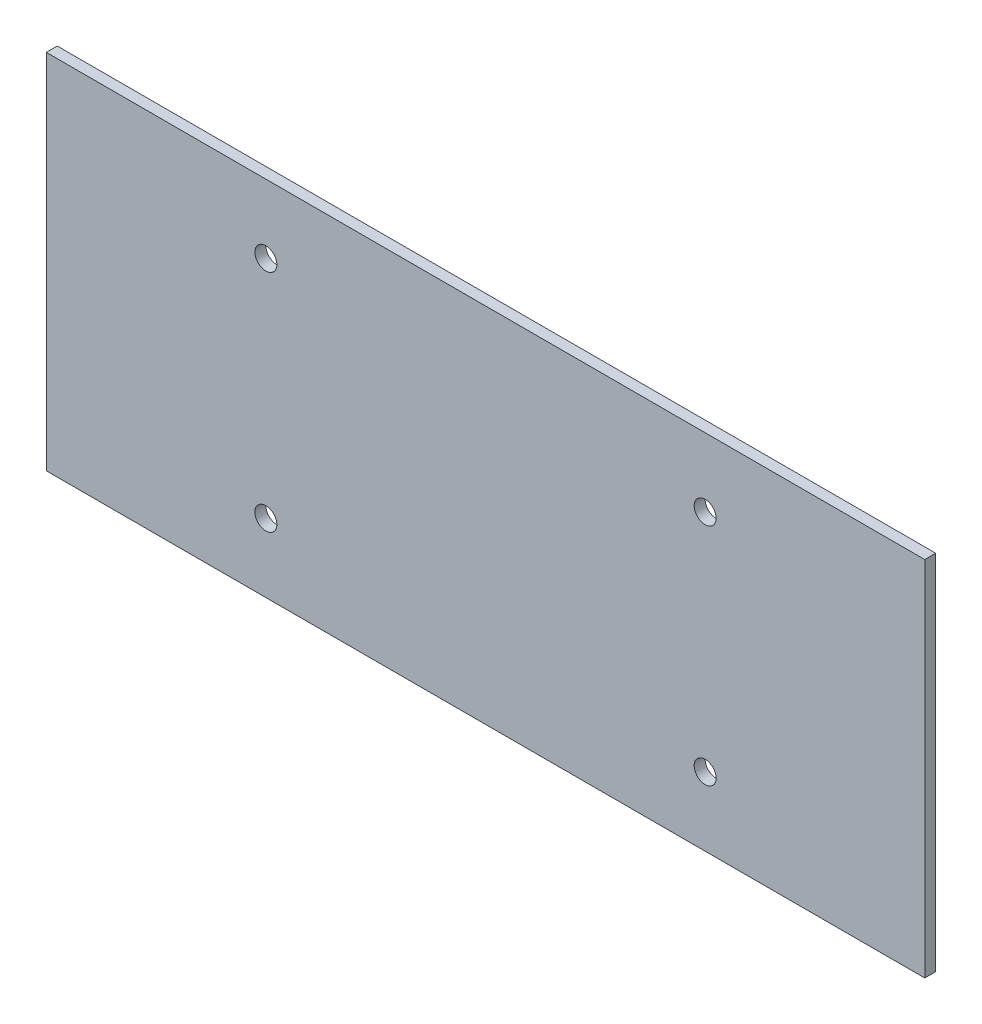
ISO-10303-21;
HEADER;
FILE_DESCRIPTION(('STEP AP214'),'2;1');
FILE_NAME('part.step','',(''),(''),'','','');
FILE_SCHEMA(('AUTOMOTIVE_DESIGN { 1 0 10303 214 1 1 1 1 }'));
ENDSEC;
DATA;
#1=APPLICATION_CONTEXT('core data for automotive mechanical design processes');
#2=APPLICATION_PROTOCOL_DEFINITION('international standard','automotive_design',2000,#1);
#3=PRODUCT_CONTEXT('',#1,'mechanical');
#4=PRODUCT('Part','Part','',(#3));
#5=PRODUCT_RELATED_PRODUCT_CATEGORY('part','',(#4));
#6=PRODUCT_DEFINITION_FORMATION('','',#4);
#7=PRODUCT_DEFINITION_CONTEXT('part definition',#1,'design');
#8=PRODUCT_DEFINITION('design','',#6,#7);
#9=PRODUCT_DEFINITION_SHAPE('','',#8);
#10=(LENGTH_UNIT() NAMED_UNIT(*) SI_UNIT(.MILLI.,.METRE.));
#11=(NAMED_UNIT(*) PLANE_ANGLE_UNIT() SI_UNIT($,.RADIAN.));
#12=(NAMED_UNIT(*) SI_UNIT($,.STERADIAN.) SOLID_ANGLE_UNIT());
#13=UNCERTAINTY_MEASURE_WITH_UNIT(LENGTH_MEASURE(1.E-05),#10,'distance_accuracy_value','');
#14=(GEOMETRIC_REPRESENTATION_CONTEXT(3) GLOBAL_UNCERTAINTY_ASSIGNED_CONTEXT((#13)) GLOBAL_UNIT_ASSIGNED_CONTEXT((#10,
#11,#12)) REPRESENTATION_CONTEXT('',''));
#15=CARTESIAN_POINT('',(0.,0.,0.));
#16=DIRECTION('',(0.,0.,1.));
#17=DIRECTION('',(1.,0.,0.));
#18=AXIS2_PLACEMENT_3D('',#15,#16,#17);
#19=CARTESIAN_POINT('',(0.,0.,2.));
#20=DIRECTION('',(1.,0.,0.));
#21=DIRECTION('',(0.,0.,-1.));
#22=AXIS2_PLACEMENT_3D('',#19,#20,#21);
#23=PLANE('',#22);
#24=DIRECTION('',(0.,-1.,0.));
#25=VECTOR('',#24,1.);
#26=CARTESIAN_POINT('',(0.,0.,0.));
#27=LINE('',#26,#25);
#28=CARTESIAN_POINT('',(0.,66.,0.));
#29=VERTEX_POINT('',#28);
#30=CARTESIAN_POINT('',(0.,0.,0.));
#31=VERTEX_POINT('',#30);
#32=EDGE_CURVE('E107',#29,#31,#27,.T.);
#33=ORIENTED_EDGE('',*,*,#32,.T.);
#34=DIRECTION('',(0.,0.,-1.));
#35=VECTOR('',#34,1.);
#36=CARTESIAN_POINT('',(0.,0.,2.));
#37=LINE('',#36,#35);
#38=CARTESIAN_POINT('',(0.,0.,2.));
#39=VERTEX_POINT('',#38);
#40=EDGE_CURVE('E11',#39,#31,#37,.T.);
#41=ORIENTED_EDGE('',*,*,#40,.F.);
#42=DIRECTION('',(0.,-1.,0.));
#43=VECTOR('',#42,1.);
#44=CARTESIAN_POINT('',(0.,0.,2.));
#45=LINE('',#44,#43);
#46=CARTESIAN_POINT('',(0.,66.,2.));
#47=VERTEX_POINT('',#46);
#48=EDGE_CURVE('E91',#47,#39,#45,.T.);
#49=ORIENTED_EDGE('',*,*,#48,.F.);
#50=DIRECTION('',(0.,0.,-1.));
#51=VECTOR('',#50,1.);
#52=CARTESIAN_POINT('',(0.,66.,2.));
#53=LINE('',#52,#51);
#54=EDGE_CURVE('E103',#47,#29,#53,.T.);
#55=ORIENTED_EDGE('',*,*,#54,.T.);
#56=EDGE_LOOP('',(#33,#41,#49,#55));
#57=FACE_BOUND('',#56,.T.);
#58=ADVANCED_FACE('F39',(#57),#23,.F.);
#59=CARTESIAN_POINT('',(0.,0.,2.));
#60=DIRECTION('',(0.,1.,0.));
#61=DIRECTION('',(0.,0.,1.));
#62=AXIS2_PLACEMENT_3D('',#59,#60,#61);
#63=PLANE('',#62);
#64=DIRECTION('',(1.,0.,0.));
#65=VECTOR('',#64,1.);
#66=CARTESIAN_POINT('',(0.,0.,0.));
#67=LINE('',#66,#65);
#68=CARTESIAN_POINT('',(160.,0.,0.));
#69=VERTEX_POINT('',#68);
#70=EDGE_CURVE('E96',#31,#69,#67,.T.);
#71=ORIENTED_EDGE('',*,*,#70,.T.);
#72=DIRECTION('',(0.,0.,-1.));
#73=VECTOR('',#72,1.);
#74=CARTESIAN_POINT('',(160.,0.,2.));
#75=LINE('',#74,#73);
#76=CARTESIAN_POINT('',(160.,0.,2.));
#77=VERTEX_POINT('',#76);
#78=EDGE_CURVE('E48',#77,#69,#75,.T.);
#79=ORIENTED_EDGE('',*,*,#78,.F.);
#80=DIRECTION('',(1.,0.,0.));
#81=VECTOR('',#80,1.);
#82=CARTESIAN_POINT('',(0.,0.,2.));
#83=LINE('',#82,#81);
#84=EDGE_CURVE('E86',#39,#77,#83,.T.);
#85=ORIENTED_EDGE('',*,*,#84,.F.);
#86=ORIENTED_EDGE('',*,*,#40,.T.);
#87=EDGE_LOOP('',(#71,#79,#85,#86));
#88=FACE_BOUND('',#87,.T.);
#89=ADVANCED_FACE('F95',(#88),#63,.F.);
#90=CARTESIAN_POINT('',(160.,0.,2.));
#91=DIRECTION('',(-1.,0.,0.));
#92=DIRECTION('',(0.,0.,1.));
#93=AXIS2_PLACEMENT_3D('',#90,#91,#92);
#94=PLANE('',#93);
#95=DIRECTION('',(0.,1.,0.));
#96=VECTOR('',#95,1.);
#97=CARTESIAN_POINT('',(160.,0.,0.));
#98=LINE('',#97,#96);
#99=CARTESIAN_POINT('',(160.,66.,0.));
#100=VERTEX_POINT('',#99);
#101=EDGE_CURVE('E73',#69,#100,#98,.T.);
#102=ORIENTED_EDGE('',*,*,#101,.T.);
#103=DIRECTION('',(0.,0.,-1.));
#104=VECTOR('',#103,1.);
#105=CARTESIAN_POINT('',(160.,66.,2.));
#106=LINE('',#105,#104);
#107=CARTESIAN_POINT('',(160.,66.,2.));
#108=VERTEX_POINT('',#107);
#109=EDGE_CURVE('E98',#108,#100,#106,.T.);
#110=ORIENTED_EDGE('',*,*,#109,.F.);
#111=DIRECTION('',(0.,1.,0.));
#112=VECTOR('',#111,1.);
#113=CARTESIAN_POINT('',(160.,0.,2.));
#114=LINE('',#113,#112);
#115=EDGE_CURVE('E89',#77,#108,#114,.T.);
#116=ORIENTED_EDGE('',*,*,#115,.F.);
#117=ORIENTED_EDGE('',*,*,#78,.T.);
#118=EDGE_LOOP('',(#102,#110,#116,#117));
#119=FACE_BOUND('',#118,.T.);
#120=ADVANCED_FACE('F99',(#119),#94,.F.);
#121=CARTESIAN_POINT('',(0.,66.,2.));
#122=DIRECTION('',(0.,-1.,0.));
#123=DIRECTION('',(0.,0.,-1.));
#124=AXIS2_PLACEMENT_3D('',#121,#122,#123);
#125=PLANE('',#124);
#126=DIRECTION('',(-1.,0.,0.));
#127=VECTOR('',#126,1.);
#128=CARTESIAN_POINT('',(0.,66.,0.));
#129=LINE('',#128,#127);
#130=EDGE_CURVE('E79',#100,#29,#129,.T.);
#131=ORIENTED_EDGE('',*,*,#130,.T.);
#132=ORIENTED_EDGE('',*,*,#54,.F.);
#133=DIRECTION('',(-1.,0.,0.));
#134=VECTOR('',#133,1.);
#135=CARTESIAN_POINT('',(0.,66.,2.));
#136=LINE('',#135,#134);
#137=EDGE_CURVE('E56',#108,#47,#136,.T.);
#138=ORIENTED_EDGE('',*,*,#137,.F.);
#139=ORIENTED_EDGE('',*,*,#109,.T.);
#140=EDGE_LOOP('',(#131,#132,#138,#139));
#141=FACE_BOUND('',#140,.T.);
#142=ADVANCED_FACE('F121',(#141),#125,.F.);
#143=CARTESIAN_POINT('',(0.,0.,2.));
#144=DIRECTION('',(0.,0.,-1.));
#145=DIRECTION('',(-1.,0.,0.));
#146=AXIS2_PLACEMENT_3D('',#143,#144,#145);
#147=PLANE('',#146);
#148=CARTESIAN_POINT('',(120.,53.5,2.));
#149=DIRECTION('',(0.,0.,1.));
#150=DIRECTION('',(1.,0.,0.));
#151=AXIS2_PLACEMENT_3D('',#148,#149,#150);
#152=CIRCLE('',#151,2.);
#153=CARTESIAN_POINT('',(122.,53.5,2.));
#154=VERTEX_POINT('',#153);
#155=EDGE_CURVE('E145',#154,#154,#152,.T.);
#156=ORIENTED_EDGE('',*,*,#155,.F.);
#157=EDGE_LOOP('',(#156));
#158=FACE_BOUND('',#157,.T.);
#159=CARTESIAN_POINT('',(40.,12.5,2.));
#160=DIRECTION('',(0.,0.,1.));
#161=DIRECTION('',(1.,0.,0.));
#162=AXIS2_PLACEMENT_3D('',#159,#160,#161);
#163=CIRCLE('',#162,2.);
#164=CARTESIAN_POINT('',(42.,12.5,2.));
#165=VERTEX_POINT('',#164);
#166=EDGE_CURVE('E136',#165,#165,#163,.T.);
#167=ORIENTED_EDGE('',*,*,#166,.F.);
#168=EDGE_LOOP('',(#167));
#169=FACE_BOUND('',#168,.T.);
#170=CARTESIAN_POINT('',(120.,12.5,2.));
#171=DIRECTION('',(0.,0.,1.));
#172=DIRECTION('',(1.,0.,0.));
#173=AXIS2_PLACEMENT_3D('',#170,#171,#172);
#174=CIRCLE('',#173,2.);
#175=CARTESIAN_POINT('',(122.,12.5,2.));
#176=VERTEX_POINT('',#175);
#177=EDGE_CURVE('E152',#176,#176,#174,.T.);
#178=ORIENTED_EDGE('',*,*,#177,.F.);
#179=EDGE_LOOP('',(#178));
#180=FACE_BOUND('',#179,.T.);
#181=CARTESIAN_POINT('',(40.,53.5,2.));
#182=DIRECTION('',(0.,0.,1.));
#183=DIRECTION('',(1.,0.,0.));
#184=AXIS2_PLACEMENT_3D('',#181,#182,#183);
#185=CIRCLE('',#184,2.);
#186=CARTESIAN_POINT('',(42.,53.5,2.));
#187=VERTEX_POINT('',#186);
#188=EDGE_CURVE('E128',#187,#187,#185,.T.);
#189=ORIENTED_EDGE('',*,*,#188,.F.);
#190=EDGE_LOOP('',(#189));
#191=FACE_BOUND('',#190,.T.);
#192=ORIENTED_EDGE('',*,*,#48,.T.);
#193=ORIENTED_EDGE('',*,*,#84,.T.);
#194=ORIENTED_EDGE('',*,*,#115,.T.);
#195=ORIENTED_EDGE('',*,*,#137,.T.);
#196=EDGE_LOOP('',(#192,#193,#194,#195));
#197=FACE_BOUND('',#196,.T.);
#198=ADVANCED_FACE('F87',(#158,#169,#180,#191,#197),#147,.F.);
#199=CARTESIAN_POINT('',(0.,0.,0.));
#200=DIRECTION('',(0.,0.,-1.));
#201=DIRECTION('',(-1.,0.,0.));
#202=AXIS2_PLACEMENT_3D('',#199,#200,#201);
#203=PLANE('',#202);
#204=CARTESIAN_POINT('',(120.,53.5,0.));
#205=DIRECTION('',(0.,0.,1.));
#206=DIRECTION('',(1.,0.,0.));
#207=AXIS2_PLACEMENT_3D('',#204,#205,#206);
#208=CIRCLE('',#207,2.);
#209=CARTESIAN_POINT('',(122.,53.5,0.));
#210=VERTEX_POINT('',#209);
#211=EDGE_CURVE('E132',#210,#210,#208,.T.);
#212=ORIENTED_EDGE('',*,*,#211,.T.);
#213=EDGE_LOOP('',(#212));
#214=FACE_BOUND('',#213,.T.);
#215=CARTESIAN_POINT('',(40.,12.5,0.));
#216=DIRECTION('',(0.,0.,1.));
#217=DIRECTION('',(1.,0.,0.));
#218=AXIS2_PLACEMENT_3D('',#215,#216,#217);
#219=CIRCLE('',#218,2.);
#220=CARTESIAN_POINT('',(42.,12.5,0.));
#221=VERTEX_POINT('',#220);
#222=EDGE_CURVE('E140',#221,#221,#219,.T.);
#223=ORIENTED_EDGE('',*,*,#222,.T.);
#224=EDGE_LOOP('',(#223));
#225=FACE_BOUND('',#224,.T.);
#226=CARTESIAN_POINT('',(120.,12.5,0.));
#227=DIRECTION('',(0.,0.,1.));
#228=DIRECTION('',(1.,0.,0.));
#229=AXIS2_PLACEMENT_3D('',#226,#227,#228);
#230=CIRCLE('',#229,2.);
#231=CARTESIAN_POINT('',(122.,12.5,0.));
#232=VERTEX_POINT('',#231);
#233=EDGE_CURVE('E141',#232,#232,#230,.T.);
#234=ORIENTED_EDGE('',*,*,#233,.T.);
#235=EDGE_LOOP('',(#234));
#236=FACE_BOUND('',#235,.T.);
#237=CARTESIAN_POINT('',(40.,53.5,0.));
#238=DIRECTION('',(0.,0.,1.));
#239=DIRECTION('',(1.,0.,0.));
#240=AXIS2_PLACEMENT_3D('',#237,#238,#239);
#241=CIRCLE('',#240,2.);
#242=CARTESIAN_POINT('',(42.,53.5,0.));
#243=VERTEX_POINT('',#242);
#244=EDGE_CURVE('E111',#243,#243,#241,.T.);
#245=ORIENTED_EDGE('',*,*,#244,.T.);
#246=EDGE_LOOP('',(#245));
#247=FACE_BOUND('',#246,.T.);
#248=ORIENTED_EDGE('',*,*,#32,.F.);
#249=ORIENTED_EDGE('',*,*,#130,.F.);
#250=ORIENTED_EDGE('',*,*,#101,.F.);
#251=ORIENTED_EDGE('',*,*,#70,.F.);
#252=EDGE_LOOP('',(#248,#249,#250,#251));
#253=FACE_BOUND('',#252,.T.);
#254=ADVANCED_FACE('F124',(#214,#225,#236,#247,#253),#203,.T.);
#255=CARTESIAN_POINT('',(40.,53.5,0.));
#256=DIRECTION('',(0.,0.,1.));
#257=DIRECTION('',(1.,0.,0.));
#258=AXIS2_PLACEMENT_3D('',#255,#256,#257);
#259=CYLINDRICAL_SURFACE('',#258,2.);
#260=ORIENTED_EDGE('',*,*,#244,.F.);
#261=EDGE_LOOP('',(#260));
#262=FACE_BOUND('',#261,.T.);
#263=ORIENTED_EDGE('',*,*,#188,.T.);
#264=EDGE_LOOP('',(#263));
#265=FACE_BOUND('',#264,.T.);
#266=ADVANCED_FACE('F166',(#262,#265),#259,.F.);
#267=CARTESIAN_POINT('',(120.,12.5,0.));
#268=DIRECTION('',(0.,0.,1.));
#269=DIRECTION('',(1.,0.,0.));
#270=AXIS2_PLACEMENT_3D('',#267,#268,#269);
#271=CYLINDRICAL_SURFACE('',#270,2.);
#272=ORIENTED_EDGE('',*,*,#233,.F.);
#273=EDGE_LOOP('',(#272));
#274=FACE_BOUND('',#273,.T.);
#275=ORIENTED_EDGE('',*,*,#177,.T.);
#276=EDGE_LOOP('',(#275));
#277=FACE_BOUND('',#276,.T.);
#278=ADVANCED_FACE('F162',(#274,#277),#271,.F.);
#279=CARTESIAN_POINT('',(40.,12.5,0.));
#280=DIRECTION('',(0.,0.,1.));
#281=DIRECTION('',(1.,0.,0.));
#282=AXIS2_PLACEMENT_3D('',#279,#280,#281);
#283=CYLINDRICAL_SURFACE('',#282,2.);
#284=ORIENTED_EDGE('',*,*,#222,.F.);
#285=EDGE_LOOP('',(#284));
#286=FACE_BOUND('',#285,.T.);
#287=ORIENTED_EDGE('',*,*,#166,.T.);
#288=EDGE_LOOP('',(#287));
#289=FACE_BOUND('',#288,.T.);
#290=ADVANCED_FACE('F165',(#286,#289),#283,.F.);
#291=CARTESIAN_POINT('',(120.,53.5,0.));
#292=DIRECTION('',(0.,0.,1.));
#293=DIRECTION('',(1.,0.,0.));
#294=AXIS2_PLACEMENT_3D('',#291,#292,#293);
#295=CYLINDRICAL_SURFACE('',#294,2.);
#296=ORIENTED_EDGE('',*,*,#211,.F.);
#297=EDGE_LOOP('',(#296));
#298=FACE_BOUND('',#297,.T.);
#299=ORIENTED_EDGE('',*,*,#155,.T.);
#300=EDGE_LOOP('',(#299));
#301=FACE_BOUND('',#300,.T.);
#302=ADVANCED_FACE('F227',(#298,#301),#295,.F.);
#303=CLOSED_SHELL('',(#58,#89,#120,#142,#198,#254,#266,#278,#290,#302));
#304=MANIFOLD_SOLID_BREP('B2',#303);
#305=ADVANCED_BREP_SHAPE_REPRESENTATION('',(#18,#304),#14);
#306=SHAPE_DEFINITION_REPRESENTATION(#9,#305);
ENDSEC;
END-ISO-10303-21;
